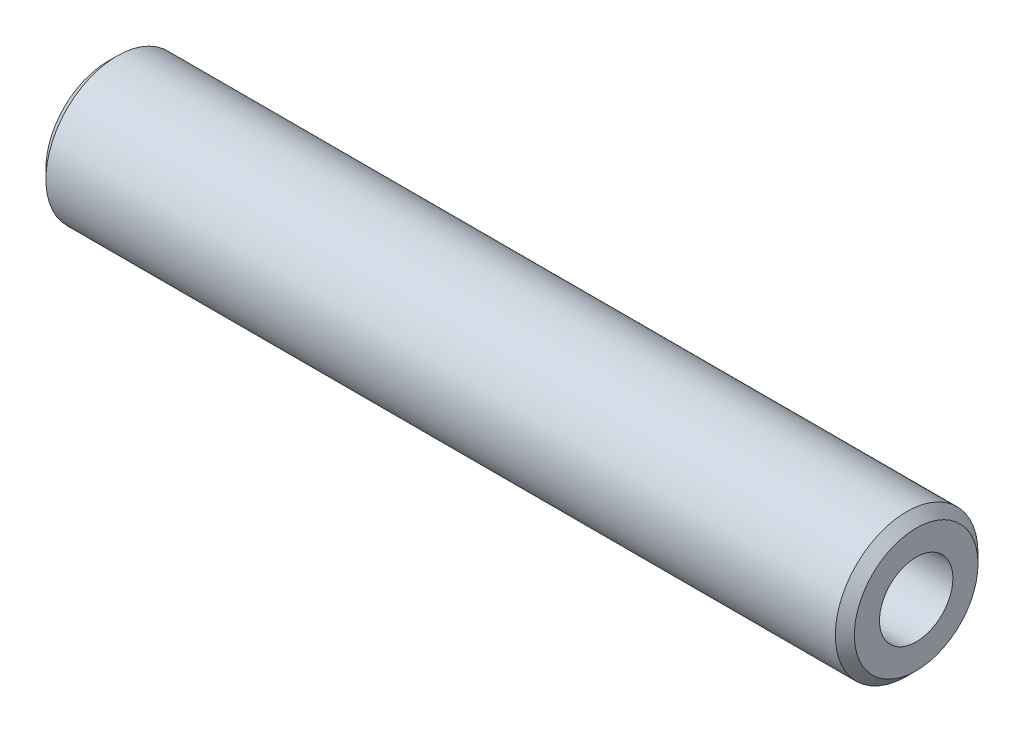
ISO-10303-21;
HEADER;
FILE_DESCRIPTION(('STEP AP214'),'2;1');
FILE_NAME('part.step','',(''),(''),'','','');
FILE_SCHEMA(('AUTOMOTIVE_DESIGN { 1 0 10303 214 1 1 1 1 }'));
ENDSEC;
DATA;
#1=APPLICATION_CONTEXT('core data for automotive mechanical design processes');
#2=APPLICATION_PROTOCOL_DEFINITION('international standard','automotive_design',2000,#1);
#3=PRODUCT_CONTEXT('',#1,'mechanical');
#4=PRODUCT('Part','Part','',(#3));
#5=PRODUCT_RELATED_PRODUCT_CATEGORY('part','',(#4));
#6=PRODUCT_DEFINITION_FORMATION('','',#4);
#7=PRODUCT_DEFINITION_CONTEXT('part definition',#1,'design');
#8=PRODUCT_DEFINITION('design','',#6,#7);
#9=PRODUCT_DEFINITION_SHAPE('','',#8);
#10=(LENGTH_UNIT() NAMED_UNIT(*) SI_UNIT(.MILLI.,.METRE.));
#11=(NAMED_UNIT(*) PLANE_ANGLE_UNIT() SI_UNIT($,.RADIAN.));
#12=(NAMED_UNIT(*) SI_UNIT($,.STERADIAN.) SOLID_ANGLE_UNIT());
#13=UNCERTAINTY_MEASURE_WITH_UNIT(LENGTH_MEASURE(1.E-05),#10,'distance_accuracy_value','');
#14=(GEOMETRIC_REPRESENTATION_CONTEXT(3) GLOBAL_UNCERTAINTY_ASSIGNED_CONTEXT((#13)) GLOBAL_UNIT_ASSIGNED_CONTEXT((#10,
#11,#12)) REPRESENTATION_CONTEXT('',''));
#15=CARTESIAN_POINT('',(0.,0.,0.));
#16=DIRECTION('',(0.,0.,1.));
#17=DIRECTION('',(1.,0.,0.));
#18=AXIS2_PLACEMENT_3D('',#15,#16,#17);
#19=CARTESIAN_POINT('',(107.95,0.,0.));
#20=DIRECTION('',(1.,0.,0.));
#21=DIRECTION('',(0.,0.,-1.));
#22=AXIS2_PLACEMENT_3D('',#19,#20,#21);
#23=PLANE('',#22);
#24=CARTESIAN_POINT('',(107.95,0.,0.));
#25=DIRECTION('',(1.,0.,0.));
#26=DIRECTION('',(0.,0.,-1.));
#27=AXIS2_PLACEMENT_3D('',#24,#25,#26);
#28=CIRCLE('',#27,8.25499999999998);
#29=CARTESIAN_POINT('',(107.95,0.,-8.25499999999998));
#30=VERTEX_POINT('',#29);
#31=EDGE_CURVE('E55',#30,#30,#28,.T.);
#32=ORIENTED_EDGE('',*,*,#31,.T.);
#33=EDGE_LOOP('',(#32));
#34=FACE_BOUND('',#33,.T.);
#35=CARTESIAN_POINT('',(107.95,0.,0.));
#36=DIRECTION('',(1.,0.,0.));
#37=DIRECTION('',(0.,0.,-1.));
#38=AXIS2_PLACEMENT_3D('',#35,#36,#37);
#39=CIRCLE('',#38,4.9022);
#40=CARTESIAN_POINT('',(107.95,0.,-4.9022));
#41=VERTEX_POINT('',#40);
#42=EDGE_CURVE('E60',#41,#41,#39,.T.);
#43=ORIENTED_EDGE('',*,*,#42,.F.);
#44=EDGE_LOOP('',(#43));
#45=FACE_BOUND('',#44,.T.);
#46=ADVANCED_FACE('F39',(#34,#45),#23,.T.);
#47=CARTESIAN_POINT('',(0.,0.,0.));
#48=DIRECTION('',(1.,0.,0.));
#49=DIRECTION('',(0.,0.,-1.));
#50=AXIS2_PLACEMENT_3D('',#47,#48,#49);
#51=PLANE('',#50);
#52=CARTESIAN_POINT('',(0.,0.,0.));
#53=DIRECTION('',(1.,0.,0.));
#54=DIRECTION('',(0.,0.,-1.));
#55=AXIS2_PLACEMENT_3D('',#52,#53,#54);
#56=CIRCLE('',#55,8.25499999999998);
#57=CARTESIAN_POINT('',(0.,0.,-8.25499999999998));
#58=VERTEX_POINT('',#57);
#59=EDGE_CURVE('E10',#58,#58,#56,.F.);
#60=ORIENTED_EDGE('',*,*,#59,.T.);
#61=EDGE_LOOP('',(#60));
#62=FACE_BOUND('',#61,.T.);
#63=CARTESIAN_POINT('',(0.,0.,0.));
#64=DIRECTION('',(1.,0.,0.));
#65=DIRECTION('',(0.,0.,-1.));
#66=AXIS2_PLACEMENT_3D('',#63,#64,#65);
#67=CIRCLE('',#66,4.9022);
#68=CARTESIAN_POINT('',(0.,0.,-4.9022));
#69=VERTEX_POINT('',#68);
#70=EDGE_CURVE('E61',#69,#69,#67,.T.);
#71=ORIENTED_EDGE('',*,*,#70,.T.);
#72=EDGE_LOOP('',(#71));
#73=FACE_BOUND('',#72,.T.);
#74=ADVANCED_FACE('F71',(#62,#73),#51,.F.);
#75=CARTESIAN_POINT('',(107.95,0.,0.));
#76=DIRECTION('',(-1.,0.,0.));
#77=DIRECTION('',(0.,0.,1.));
#78=AXIS2_PLACEMENT_3D('',#75,#76,#77);
#79=CYLINDRICAL_SURFACE('',#78,9.525);
#80=CARTESIAN_POINT('',(106.68,0.,0.));
#81=DIRECTION('',(1.,0.,0.));
#82=DIRECTION('',(0.,0.,-1.));
#83=AXIS2_PLACEMENT_3D('',#80,#81,#82);
#84=CIRCLE('',#83,9.525);
#85=CARTESIAN_POINT('',(106.68,0.,-9.525));
#86=VERTEX_POINT('',#85);
#87=EDGE_CURVE('E47',#86,#86,#84,.F.);
#88=ORIENTED_EDGE('',*,*,#87,.T.);
#89=EDGE_LOOP('',(#88));
#90=FACE_BOUND('',#89,.T.);
#91=CARTESIAN_POINT('',(1.26999999999999,0.,0.));
#92=DIRECTION('',(1.,0.,0.));
#93=DIRECTION('',(0.,0.,-1.));
#94=AXIS2_PLACEMENT_3D('',#91,#92,#93);
#95=CIRCLE('',#94,9.525);
#96=CARTESIAN_POINT('',(1.26999999999999,0.,-9.525));
#97=VERTEX_POINT('',#96);
#98=EDGE_CURVE('E51',#97,#97,#95,.T.);
#99=ORIENTED_EDGE('',*,*,#98,.T.);
#100=EDGE_LOOP('',(#99));
#101=FACE_BOUND('',#100,.T.);
#102=ADVANCED_FACE('F78',(#90,#101),#79,.T.);
#103=CARTESIAN_POINT('',(107.95,0.,0.));
#104=DIRECTION('',(-1.,0.,0.));
#105=DIRECTION('',(0.,0.,1.));
#106=AXIS2_PLACEMENT_3D('',#103,#104,#105);
#107=CYLINDRICAL_SURFACE('',#106,4.9022);
#108=ORIENTED_EDGE('',*,*,#42,.T.);
#109=EDGE_LOOP('',(#108));
#110=FACE_BOUND('',#109,.T.);
#111=ORIENTED_EDGE('',*,*,#70,.F.);
#112=EDGE_LOOP('',(#111));
#113=FACE_BOUND('',#112,.T.);
#114=ADVANCED_FACE('F67',(#110,#113),#107,.F.);
#115=CARTESIAN_POINT('',(107.95,0.,0.));
#116=DIRECTION('',(-1.,0.,0.));
#117=DIRECTION('',(0.,0.,1.));
#118=AXIS2_PLACEMENT_3D('',#115,#116,#117);
#119=CONICAL_SURFACE('',#118,8.25499999999998,0.785398163397446);
#120=ORIENTED_EDGE('',*,*,#87,.F.);
#121=EDGE_LOOP('',(#120));
#122=FACE_BOUND('',#121,.T.);
#123=ORIENTED_EDGE('',*,*,#31,.F.);
#124=EDGE_LOOP('',(#123));
#125=FACE_BOUND('',#124,.T.);
#126=ADVANCED_FACE('F84',(#122,#125),#119,.T.);
#127=CARTESIAN_POINT('',(1.26999999999999,0.,0.));
#128=DIRECTION('',(1.,0.,0.));
#129=DIRECTION('',(0.,0.,-1.));
#130=AXIS2_PLACEMENT_3D('',#127,#128,#129);
#131=CONICAL_SURFACE('',#130,9.525,0.785398163397457);
#132=ORIENTED_EDGE('',*,*,#59,.F.);
#133=EDGE_LOOP('',(#132));
#134=FACE_BOUND('',#133,.T.);
#135=ORIENTED_EDGE('',*,*,#98,.F.);
#136=EDGE_LOOP('',(#135));
#137=FACE_BOUND('',#136,.T.);
#138=ADVANCED_FACE('F42',(#134,#137),#131,.T.);
#139=CLOSED_SHELL('',(#46,#74,#102,#114,#126,#138));
#140=MANIFOLD_SOLID_BREP('B2',#139);
#141=ADVANCED_BREP_SHAPE_REPRESENTATION('',(#18,#140),#14);
#142=SHAPE_DEFINITION_REPRESENTATION(#9,#141);
ENDSEC;
END-ISO-10303-21;
